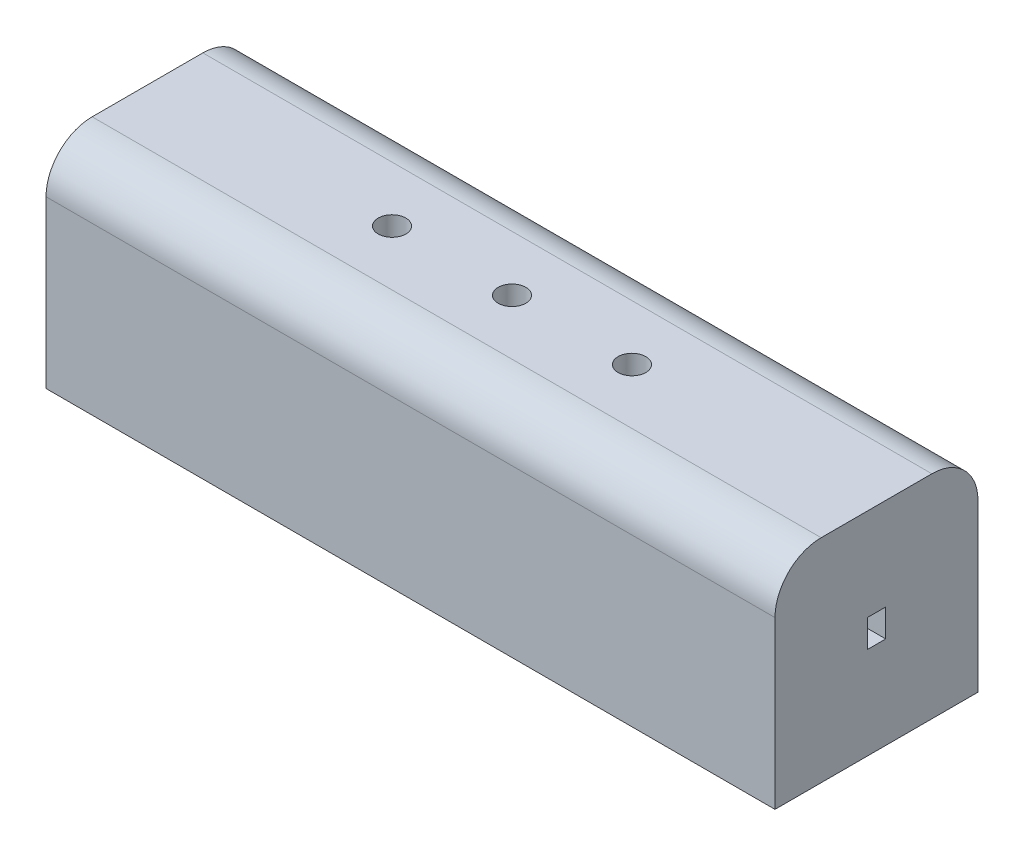
ISO-10303-21;
HEADER;
FILE_DESCRIPTION(('STEP AP214'),'2;1');
FILE_NAME('part.step','',(''),(''),'','','');
FILE_SCHEMA(('AUTOMOTIVE_DESIGN { 1 0 10303 214 1 1 1 1 }'));
ENDSEC;
DATA;
#1=APPLICATION_CONTEXT('core data for automotive mechanical design processes');
#2=APPLICATION_PROTOCOL_DEFINITION('international standard','automotive_design',2000,#1);
#3=PRODUCT_CONTEXT('',#1,'mechanical');
#4=PRODUCT('Part','Part','',(#3));
#5=PRODUCT_RELATED_PRODUCT_CATEGORY('part','',(#4));
#6=PRODUCT_DEFINITION_FORMATION('','',#4);
#7=PRODUCT_DEFINITION_CONTEXT('part definition',#1,'design');
#8=PRODUCT_DEFINITION('design','',#6,#7);
#9=PRODUCT_DEFINITION_SHAPE('','',#8);
#10=(LENGTH_UNIT() NAMED_UNIT(*) SI_UNIT(.MILLI.,.METRE.));
#11=(NAMED_UNIT(*) PLANE_ANGLE_UNIT() SI_UNIT($,.RADIAN.));
#12=(NAMED_UNIT(*) SI_UNIT($,.STERADIAN.) SOLID_ANGLE_UNIT());
#13=UNCERTAINTY_MEASURE_WITH_UNIT(LENGTH_MEASURE(1.E-05),#10,'distance_accuracy_value','');
#14=(GEOMETRIC_REPRESENTATION_CONTEXT(3) GLOBAL_UNCERTAINTY_ASSIGNED_CONTEXT((#13)) GLOBAL_UNIT_ASSIGNED_CONTEXT((#10,
#11,#12)) REPRESENTATION_CONTEXT('',''));
#15=CARTESIAN_POINT('',(0.,0.,0.));
#16=DIRECTION('',(0.,0.,1.));
#17=DIRECTION('',(1.,0.,0.));
#18=AXIS2_PLACEMENT_3D('',#15,#16,#17);
#19=CARTESIAN_POINT('',(39.5,0.,-1.));
#20=DIRECTION('',(0.,0.,-1.));
#21=DIRECTION('',(-1.,0.,0.));
#22=AXIS2_PLACEMENT_3D('',#19,#20,#21);
#23=PLANE('',#22);
#24=DIRECTION('',(-1.,0.,0.));
#25=VECTOR('',#24,1.);
#26=CARTESIAN_POINT('',(39.5,10.,-1.));
#27=LINE('',#26,#25);
#28=CARTESIAN_POINT('',(-14.1180339887499,10.,-1.));
#29=VERTEX_POINT('',#28);
#30=CARTESIAN_POINT('',(-39.5,10.,-1.));
#31=VERTEX_POINT('',#30);
#32=EDGE_CURVE('E282',#29,#31,#27,.T.);
#33=ORIENTED_EDGE('',*,*,#32,.F.);
#34=DIRECTION('',(0.,1.,0.));
#35=VECTOR('',#34,1.);
#36=CARTESIAN_POINT('',(-14.1180339887499,-1.2E-05,-1.));
#37=LINE('',#36,#35);
#38=CARTESIAN_POINT('',(-14.1180339887499,13.,-1.));
#39=VERTEX_POINT('',#38);
#40=EDGE_CURVE('E252',#29,#39,#37,.T.);
#41=ORIENTED_EDGE('',*,*,#40,.T.);
#42=DIRECTION('',(-1.,0.,0.));
#43=VECTOR('',#42,1.);
#44=CARTESIAN_POINT('',(39.5,13.,-1.));
#45=LINE('',#44,#43);
#46=CARTESIAN_POINT('',(-39.5,13.,-1.));
#47=VERTEX_POINT('',#46);
#48=EDGE_CURVE('E338',#39,#47,#45,.T.);
#49=ORIENTED_EDGE('',*,*,#48,.T.);
#50=DIRECTION('',(0.,-1.,0.));
#51=VECTOR('',#50,1.);
#52=CARTESIAN_POINT('',(-39.5,0.,-1.));
#53=LINE('',#52,#51);
#54=EDGE_CURVE('E408',#47,#31,#53,.T.);
#55=ORIENTED_EDGE('',*,*,#54,.T.);
#56=EDGE_LOOP('',(#33,#41,#49,#55));
#57=FACE_BOUND('',#56,.T.);
#58=ADVANCED_FACE('F98',(#57),#23,.F.);
#59=CARTESIAN_POINT('',(39.5,13.,0.));
#60=DIRECTION('',(0.,1.,0.));
#61=DIRECTION('',(0.,0.,1.));
#62=AXIS2_PLACEMENT_3D('',#59,#60,#61);
#63=PLANE('',#62);
#64=DIRECTION('',(-1.,0.,0.));
#65=VECTOR('',#64,1.);
#66=CARTESIAN_POINT('',(39.5,13.,0.999999999999997));
#67=LINE('',#66,#65);
#68=CARTESIAN_POINT('',(39.5,13.,0.999999999999997));
#69=VERTEX_POINT('',#68);
#70=CARTESIAN_POINT('',(14.1180339887499,13.,0.999999999999997));
#71=VERTEX_POINT('',#70);
#72=EDGE_CURVE('E289',#69,#71,#67,.T.);
#73=ORIENTED_EDGE('',*,*,#72,.T.);
#74=CARTESIAN_POINT('',(13.,13.,0.));
#75=DIRECTION('',(0.,1.,0.));
#76=DIRECTION('',(0.,0.,1.));
#77=AXIS2_PLACEMENT_3D('',#74,#75,#76);
#78=CIRCLE('',#77,1.5);
#79=CARTESIAN_POINT('',(14.1180339887499,13.,-1.));
#80=VERTEX_POINT('',#79);
#81=EDGE_CURVE('E398',#71,#80,#78,.T.);
#82=ORIENTED_EDGE('',*,*,#81,.T.);
#83=CARTESIAN_POINT('',(39.5,13.,-1.));
#84=VERTEX_POINT('',#83);
#85=EDGE_CURVE('E332',#84,#80,#45,.T.);
#86=ORIENTED_EDGE('',*,*,#85,.F.);
#87=DIRECTION('',(0.,0.,-1.));
#88=VECTOR('',#87,1.);
#89=CARTESIAN_POINT('',(39.5,13.,0.));
#90=LINE('',#89,#88);
#91=EDGE_CURVE('E439',#69,#84,#90,.T.);
#92=ORIENTED_EDGE('',*,*,#91,.F.);
#93=EDGE_LOOP('',(#73,#82,#86,#92));
#94=FACE_BOUND('',#93,.T.);
#95=ADVANCED_FACE('F463',(#94),#63,.F.);
#96=CARTESIAN_POINT('',(39.5,0.,0.999999999999997));
#97=DIRECTION('',(0.,0.,-1.));
#98=DIRECTION('',(-1.,0.,0.));
#99=AXIS2_PLACEMENT_3D('',#96,#97,#98);
#100=PLANE('',#99);
#101=DIRECTION('',(0.,1.,0.));
#102=VECTOR('',#101,1.);
#103=CARTESIAN_POINT('',(-14.1180339887499,-1.2E-05,0.999999999999997));
#104=LINE('',#103,#102);
#105=CARTESIAN_POINT('',(-14.1180339887499,10.,0.999999999999997));
#106=VERTEX_POINT('',#105);
#107=CARTESIAN_POINT('',(-14.1180339887499,13.,0.999999999999997));
#108=VERTEX_POINT('',#107);
#109=EDGE_CURVE('E249',#106,#108,#104,.T.);
#110=ORIENTED_EDGE('',*,*,#109,.F.);
#111=DIRECTION('',(-1.,0.,0.));
#112=VECTOR('',#111,1.);
#113=CARTESIAN_POINT('',(39.5,10.,0.999999999999997));
#114=LINE('',#113,#112);
#115=CARTESIAN_POINT('',(-39.5,10.,0.999999999999997));
#116=VERTEX_POINT('',#115);
#117=EDGE_CURVE('E263',#106,#116,#114,.T.);
#118=ORIENTED_EDGE('',*,*,#117,.T.);
#119=DIRECTION('',(0.,-1.,0.));
#120=VECTOR('',#119,1.);
#121=CARTESIAN_POINT('',(-39.5,0.,0.999999999999997));
#122=LINE('',#121,#120);
#123=CARTESIAN_POINT('',(-39.5,13.,0.999999999999997));
#124=VERTEX_POINT('',#123);
#125=EDGE_CURVE('E411',#124,#116,#122,.T.);
#126=ORIENTED_EDGE('',*,*,#125,.F.);
#127=EDGE_CURVE('E265',#108,#124,#67,.T.);
#128=ORIENTED_EDGE('',*,*,#127,.F.);
#129=EDGE_LOOP('',(#110,#118,#126,#128));
#130=FACE_BOUND('',#129,.T.);
#131=ADVANCED_FACE('F261',(#130),#100,.T.);
#132=CARTESIAN_POINT('',(39.5,10.,0.));
#133=DIRECTION('',(0.,1.,0.));
#134=DIRECTION('',(0.,0.,1.));
#135=AXIS2_PLACEMENT_3D('',#132,#133,#134);
#136=PLANE('',#135);
#137=CARTESIAN_POINT('',(13.,10.,0.));
#138=DIRECTION('',(0.,1.,0.));
#139=DIRECTION('',(0.,0.,1.));
#140=AXIS2_PLACEMENT_3D('',#137,#138,#139);
#141=CIRCLE('',#140,1.5);
#142=CARTESIAN_POINT('',(14.1180339887499,10.,0.999999999999997));
#143=VERTEX_POINT('',#142);
#144=CARTESIAN_POINT('',(14.1180339887499,10.,-1.));
#145=VERTEX_POINT('',#144);
#146=EDGE_CURVE('E12',#143,#145,#141,.T.);
#147=ORIENTED_EDGE('',*,*,#146,.F.);
#148=CARTESIAN_POINT('',(39.5,10.,0.999999999999997));
#149=VERTEX_POINT('',#148);
#150=EDGE_CURVE('E276',#149,#143,#114,.T.);
#151=ORIENTED_EDGE('',*,*,#150,.F.);
#152=DIRECTION('',(0.,0.,-1.));
#153=VECTOR('',#152,1.);
#154=CARTESIAN_POINT('',(39.5,10.,0.));
#155=LINE('',#154,#153);
#156=CARTESIAN_POINT('',(39.5,10.,-1.));
#157=VERTEX_POINT('',#156);
#158=EDGE_CURVE('E436',#149,#157,#155,.T.);
#159=ORIENTED_EDGE('',*,*,#158,.T.);
#160=EDGE_CURVE('E274',#157,#145,#27,.T.);
#161=ORIENTED_EDGE('',*,*,#160,.T.);
#162=EDGE_LOOP('',(#147,#151,#159,#161));
#163=FACE_BOUND('',#162,.T.);
#164=ADVANCED_FACE('F531',(#163),#136,.T.);
#165=CARTESIAN_POINT('',(39.5,0.,-11.));
#166=DIRECTION('',(0.,0.,-1.));
#167=DIRECTION('',(-1.,0.,0.));
#168=AXIS2_PLACEMENT_3D('',#165,#166,#167);
#169=PLANE('',#168);
#170=DIRECTION('',(-1.,0.,0.));
#171=VECTOR('',#170,1.);
#172=CARTESIAN_POINT('',(39.5,0.,-11.));
#173=LINE('',#172,#171);
#174=CARTESIAN_POINT('',(39.5,0.,-11.));
#175=VERTEX_POINT('',#174);
#176=CARTESIAN_POINT('',(-39.5,0.,-11.));
#177=VERTEX_POINT('',#176);
#178=EDGE_CURVE('E307',#175,#177,#173,.T.);
#179=ORIENTED_EDGE('',*,*,#178,.T.);
#180=DIRECTION('',(0.,-1.,0.));
#181=VECTOR('',#180,1.);
#182=CARTESIAN_POINT('',(-39.5,0.,-11.));
#183=LINE('',#182,#181);
#184=CARTESIAN_POINT('',(-39.5,18.,-11.));
#185=VERTEX_POINT('',#184);
#186=EDGE_CURVE('E415',#185,#177,#183,.T.);
#187=ORIENTED_EDGE('',*,*,#186,.F.);
#188=DIRECTION('',(-1.,0.,0.));
#189=VECTOR('',#188,1.);
#190=CARTESIAN_POINT('',(39.5,18.,-11.));
#191=LINE('',#190,#189);
#192=CARTESIAN_POINT('',(39.5,18.,-11.));
#193=VERTEX_POINT('',#192);
#194=EDGE_CURVE('E257',#193,#185,#191,.T.);
#195=ORIENTED_EDGE('',*,*,#194,.F.);
#196=DIRECTION('',(0.,-1.,0.));
#197=VECTOR('',#196,1.);
#198=CARTESIAN_POINT('',(39.5,0.,-11.));
#199=LINE('',#198,#197);
#200=EDGE_CURVE('E330',#193,#175,#199,.T.);
#201=ORIENTED_EDGE('',*,*,#200,.T.);
#202=EDGE_LOOP('',(#179,#187,#195,#201));
#203=FACE_BOUND('',#202,.T.);
#204=ADVANCED_FACE('F100',(#203),#169,.T.);
#205=CARTESIAN_POINT('',(39.5,18.,-6.));
#206=DIRECTION('',(-1.,0.,0.));
#207=DIRECTION('',(0.,0.,1.));
#208=AXIS2_PLACEMENT_3D('',#205,#206,#207);
#209=CYLINDRICAL_SURFACE('',#208,5.);
#210=ORIENTED_EDGE('',*,*,#194,.T.);
#211=CARTESIAN_POINT('',(-39.5,18.,-6.));
#212=DIRECTION('',(1.,0.,0.));
#213=DIRECTION('',(0.,0.,-1.));
#214=AXIS2_PLACEMENT_3D('',#211,#212,#213);
#215=CIRCLE('',#214,5.);
#216=CARTESIAN_POINT('',(-39.5,23.,-5.99999999999997));
#217=VERTEX_POINT('',#216);
#218=EDGE_CURVE('E430',#185,#217,#215,.T.);
#219=ORIENTED_EDGE('',*,*,#218,.T.);
#220=DIRECTION('',(-1.,0.,0.));
#221=VECTOR('',#220,1.);
#222=CARTESIAN_POINT('',(39.5,23.,-5.99999999999997));
#223=LINE('',#222,#221);
#224=CARTESIAN_POINT('',(39.5,23.,-5.99999999999997));
#225=VERTEX_POINT('',#224);
#226=EDGE_CURVE('E316',#225,#217,#223,.T.);
#227=ORIENTED_EDGE('',*,*,#226,.F.);
#228=CARTESIAN_POINT('',(39.5,18.,-6.));
#229=DIRECTION('',(1.,0.,0.));
#230=DIRECTION('',(0.,0.,-1.));
#231=AXIS2_PLACEMENT_3D('',#228,#229,#230);
#232=CIRCLE('',#231,5.);
#233=EDGE_CURVE('E310',#193,#225,#232,.T.);
#234=ORIENTED_EDGE('',*,*,#233,.F.);
#235=EDGE_LOOP('',(#210,#219,#227,#234));
#236=FACE_BOUND('',#235,.T.);
#237=ADVANCED_FACE('F529',(#236),#209,.T.);
#238=CARTESIAN_POINT('',(39.5,23.,0.));
#239=DIRECTION('',(0.,1.,0.));
#240=DIRECTION('',(0.,0.,1.));
#241=AXIS2_PLACEMENT_3D('',#238,#239,#240);
#242=PLANE('',#241);
#243=CARTESIAN_POINT('',(13.,23.,0.));
#244=DIRECTION('',(0.,1.,0.));
#245=DIRECTION('',(0.,0.,1.));
#246=AXIS2_PLACEMENT_3D('',#243,#244,#245);
#247=CIRCLE('',#246,1.5);
#248=CARTESIAN_POINT('',(13.,23.,1.5));
#249=VERTEX_POINT('',#248);
#250=EDGE_CURVE('E267',#249,#249,#247,.T.);
#251=ORIENTED_EDGE('',*,*,#250,.F.);
#252=EDGE_LOOP('',(#251));
#253=FACE_BOUND('',#252,.T.);
#254=CARTESIAN_POINT('',(0.,23.,0.));
#255=DIRECTION('',(0.,1.,0.));
#256=DIRECTION('',(0.,0.,1.));
#257=AXIS2_PLACEMENT_3D('',#254,#255,#256);
#258=CIRCLE('',#257,1.5);
#259=CARTESIAN_POINT('',(0.,23.,1.5));
#260=VERTEX_POINT('',#259);
#261=EDGE_CURVE('E730',#260,#260,#258,.T.);
#262=ORIENTED_EDGE('',*,*,#261,.F.);
#263=EDGE_LOOP('',(#262));
#264=FACE_BOUND('',#263,.T.);
#265=CARTESIAN_POINT('',(-13.,23.,0.));
#266=DIRECTION('',(0.,1.,0.));
#267=DIRECTION('',(0.,0.,1.));
#268=AXIS2_PLACEMENT_3D('',#265,#266,#267);
#269=CIRCLE('',#268,1.5);
#270=CARTESIAN_POINT('',(-13.,23.,1.5));
#271=VERTEX_POINT('',#270);
#272=EDGE_CURVE('E733',#271,#271,#269,.T.);
#273=ORIENTED_EDGE('',*,*,#272,.F.);
#274=EDGE_LOOP('',(#273));
#275=FACE_BOUND('',#274,.T.);
#276=ORIENTED_EDGE('',*,*,#226,.T.);
#277=DIRECTION('',(0.,0.,-1.));
#278=VECTOR('',#277,1.);
#279=CARTESIAN_POINT('',(-39.5,23.,0.));
#280=LINE('',#279,#278);
#281=CARTESIAN_POINT('',(-39.5,23.,5.99999999999996));
#282=VERTEX_POINT('',#281);
#283=EDGE_CURVE('E427',#282,#217,#280,.T.);
#284=ORIENTED_EDGE('',*,*,#283,.F.);
#285=DIRECTION('',(-1.,0.,0.));
#286=VECTOR('',#285,1.);
#287=CARTESIAN_POINT('',(39.5,23.,5.99999999999996));
#288=LINE('',#287,#286);
#289=CARTESIAN_POINT('',(39.5,23.,5.99999999999996));
#290=VERTEX_POINT('',#289);
#291=EDGE_CURVE('E314',#290,#282,#288,.T.);
#292=ORIENTED_EDGE('',*,*,#291,.F.);
#293=DIRECTION('',(0.,0.,-1.));
#294=VECTOR('',#293,1.);
#295=CARTESIAN_POINT('',(39.5,23.,0.));
#296=LINE('',#295,#294);
#297=EDGE_CURVE('E320',#290,#225,#296,.T.);
#298=ORIENTED_EDGE('',*,*,#297,.T.);
#299=EDGE_LOOP('',(#276,#284,#292,#298));
#300=FACE_BOUND('',#299,.T.);
#301=ADVANCED_FACE('F524',(#253,#264,#275,#300),#242,.T.);
#302=CARTESIAN_POINT('',(39.5,18.,6.));
#303=DIRECTION('',(-1.,0.,0.));
#304=DIRECTION('',(0.,0.,1.));
#305=AXIS2_PLACEMENT_3D('',#302,#303,#304);
#306=CYLINDRICAL_SURFACE('',#305,5.);
#307=ORIENTED_EDGE('',*,*,#291,.T.);
#308=CARTESIAN_POINT('',(-39.5,18.,6.));
#309=DIRECTION('',(1.,0.,0.));
#310=DIRECTION('',(0.,0.,-1.));
#311=AXIS2_PLACEMENT_3D('',#308,#309,#310);
#312=CIRCLE('',#311,5.);
#313=CARTESIAN_POINT('',(-39.5,18.,11.));
#314=VERTEX_POINT('',#313);
#315=EDGE_CURVE('E424',#314,#282,#312,.F.);
#316=ORIENTED_EDGE('',*,*,#315,.F.);
#317=DIRECTION('',(-1.,0.,0.));
#318=VECTOR('',#317,1.);
#319=CARTESIAN_POINT('',(39.5,18.,11.));
#320=LINE('',#319,#318);
#321=CARTESIAN_POINT('',(39.5,18.,11.));
#322=VERTEX_POINT('',#321);
#323=EDGE_CURVE('E312',#322,#314,#320,.T.);
#324=ORIENTED_EDGE('',*,*,#323,.F.);
#325=CARTESIAN_POINT('',(39.5,18.,6.));
#326=DIRECTION('',(1.,0.,0.));
#327=DIRECTION('',(0.,0.,-1.));
#328=AXIS2_PLACEMENT_3D('',#325,#326,#327);
#329=CIRCLE('',#328,5.);
#330=EDGE_CURVE('E323',#322,#290,#329,.F.);
#331=ORIENTED_EDGE('',*,*,#330,.T.);
#332=EDGE_LOOP('',(#307,#316,#324,#331));
#333=FACE_BOUND('',#332,.T.);
#334=ADVANCED_FACE('F521',(#333),#306,.T.);
#335=CARTESIAN_POINT('',(39.5,0.,11.));
#336=DIRECTION('',(0.,0.,-1.));
#337=DIRECTION('',(-1.,0.,0.));
#338=AXIS2_PLACEMENT_3D('',#335,#336,#337);
#339=PLANE('',#338);
#340=ORIENTED_EDGE('',*,*,#323,.T.);
#341=DIRECTION('',(0.,-1.,0.));
#342=VECTOR('',#341,1.);
#343=CARTESIAN_POINT('',(-39.5,0.,11.));
#344=LINE('',#343,#342);
#345=CARTESIAN_POINT('',(-39.5,0.,11.));
#346=VERTEX_POINT('',#345);
#347=EDGE_CURVE('E421',#314,#346,#344,.T.);
#348=ORIENTED_EDGE('',*,*,#347,.T.);
#349=DIRECTION('',(-1.,0.,0.));
#350=VECTOR('',#349,1.);
#351=CARTESIAN_POINT('',(39.5,0.,11.));
#352=LINE('',#351,#350);
#353=CARTESIAN_POINT('',(39.5,0.,11.));
#354=VERTEX_POINT('',#353);
#355=EDGE_CURVE('E309',#354,#346,#352,.T.);
#356=ORIENTED_EDGE('',*,*,#355,.F.);
#357=DIRECTION('',(0.,-1.,0.));
#358=VECTOR('',#357,1.);
#359=CARTESIAN_POINT('',(39.5,0.,11.));
#360=LINE('',#359,#358);
#361=EDGE_CURVE('E326',#322,#354,#360,.T.);
#362=ORIENTED_EDGE('',*,*,#361,.F.);
#363=EDGE_LOOP('',(#340,#348,#356,#362));
#364=FACE_BOUND('',#363,.T.);
#365=ADVANCED_FACE('F503',(#364),#339,.F.);
#366=CARTESIAN_POINT('',(39.5,0.,0.));
#367=DIRECTION('',(0.,1.,0.));
#368=DIRECTION('',(0.,0.,1.));
#369=AXIS2_PLACEMENT_3D('',#366,#367,#368);
#370=PLANE('',#369);
#371=CARTESIAN_POINT('',(13.,0.,0.));
#372=DIRECTION('',(0.,1.,0.));
#373=DIRECTION('',(0.,0.,1.));
#374=AXIS2_PLACEMENT_3D('',#371,#372,#373);
#375=CIRCLE('',#374,1.5);
#376=CARTESIAN_POINT('',(13.,0.,1.5));
#377=VERTEX_POINT('',#376);
#378=EDGE_CURVE('E405',#377,#377,#375,.T.);
#379=ORIENTED_EDGE('',*,*,#378,.T.);
#380=EDGE_LOOP('',(#379));
#381=FACE_BOUND('',#380,.T.);
#382=CARTESIAN_POINT('',(0.,0.,0.));
#383=DIRECTION('',(0.,1.,0.));
#384=DIRECTION('',(0.,0.,1.));
#385=AXIS2_PLACEMENT_3D('',#382,#383,#384);
#386=CIRCLE('',#385,1.5);
#387=CARTESIAN_POINT('',(0.,0.,1.5));
#388=VERTEX_POINT('',#387);
#389=EDGE_CURVE('E391',#388,#388,#386,.T.);
#390=ORIENTED_EDGE('',*,*,#389,.T.);
#391=EDGE_LOOP('',(#390));
#392=FACE_BOUND('',#391,.T.);
#393=CARTESIAN_POINT('',(-13.,0.,0.));
#394=DIRECTION('',(0.,1.,0.));
#395=DIRECTION('',(0.,0.,1.));
#396=AXIS2_PLACEMENT_3D('',#393,#394,#395);
#397=CIRCLE('',#396,1.5);
#398=CARTESIAN_POINT('',(-13.,0.,1.5));
#399=VERTEX_POINT('',#398);
#400=EDGE_CURVE('E379',#399,#399,#397,.T.);
#401=ORIENTED_EDGE('',*,*,#400,.T.);
#402=EDGE_LOOP('',(#401));
#403=FACE_BOUND('',#402,.T.);
#404=ORIENTED_EDGE('',*,*,#355,.T.);
#405=DIRECTION('',(0.,0.,-1.));
#406=VECTOR('',#405,1.);
#407=CARTESIAN_POINT('',(-39.5,0.,0.));
#408=LINE('',#407,#406);
#409=EDGE_CURVE('E418',#346,#177,#408,.T.);
#410=ORIENTED_EDGE('',*,*,#409,.T.);
#411=ORIENTED_EDGE('',*,*,#178,.F.);
#412=DIRECTION('',(0.,0.,-1.));
#413=VECTOR('',#412,1.);
#414=CARTESIAN_POINT('',(39.5,0.,0.));
#415=LINE('',#414,#413);
#416=EDGE_CURVE('E328',#354,#175,#415,.T.);
#417=ORIENTED_EDGE('',*,*,#416,.F.);
#418=EDGE_LOOP('',(#404,#410,#411,#417));
#419=FACE_BOUND('',#418,.T.);
#420=ADVANCED_FACE('F500',(#381,#392,#403,#419),#370,.F.);
#421=CARTESIAN_POINT('',(39.5,18.,6.));
#422=DIRECTION('',(1.,0.,0.));
#423=DIRECTION('',(0.,0.,-1.));
#424=AXIS2_PLACEMENT_3D('',#421,#422,#423);
#425=PLANE('',#424);
#426=DIRECTION('',(0.,-1.,0.));
#427=VECTOR('',#426,1.);
#428=CARTESIAN_POINT('',(39.5,0.,-1.));
#429=LINE('',#428,#427);
#430=EDGE_CURVE('E433',#84,#157,#429,.T.);
#431=ORIENTED_EDGE('',*,*,#430,.T.);
#432=ORIENTED_EDGE('',*,*,#158,.F.);
#433=DIRECTION('',(0.,-1.,0.));
#434=VECTOR('',#433,1.);
#435=CARTESIAN_POINT('',(39.5,0.,0.999999999999997));
#436=LINE('',#435,#434);
#437=EDGE_CURVE('E438',#69,#149,#436,.T.);
#438=ORIENTED_EDGE('',*,*,#437,.F.);
#439=ORIENTED_EDGE('',*,*,#91,.T.);
#440=EDGE_LOOP('',(#431,#432,#438,#439));
#441=FACE_BOUND('',#440,.T.);
#442=ORIENTED_EDGE('',*,*,#200,.F.);
#443=ORIENTED_EDGE('',*,*,#233,.T.);
#444=ORIENTED_EDGE('',*,*,#297,.F.);
#445=ORIENTED_EDGE('',*,*,#330,.F.);
#446=ORIENTED_EDGE('',*,*,#361,.T.);
#447=ORIENTED_EDGE('',*,*,#416,.T.);
#448=EDGE_LOOP('',(#442,#443,#444,#445,#446,#447));
#449=FACE_BOUND('',#448,.T.);
#450=ADVANCED_FACE('F474',(#441,#449),#425,.T.);
#451=ORIENTED_EDGE('',*,*,#85,.T.);
#452=DIRECTION('',(0.,1.,0.));
#453=VECTOR('',#452,1.);
#454=CARTESIAN_POINT('',(14.1180339887499,-1.2E-05,-1.));
#455=LINE('',#454,#453);
#456=EDGE_CURVE('E403',#80,#145,#455,.F.);
#457=ORIENTED_EDGE('',*,*,#456,.T.);
#458=ORIENTED_EDGE('',*,*,#160,.F.);
#459=ORIENTED_EDGE('',*,*,#430,.F.);
#460=EDGE_LOOP('',(#451,#457,#458,#459));
#461=FACE_BOUND('',#460,.T.);
#462=ADVANCED_FACE('F465',(#461),#23,.F.);
#463=ORIENTED_EDGE('',*,*,#48,.F.);
#464=CARTESIAN_POINT('',(-13.,13.,0.));
#465=DIRECTION('',(0.,1.,0.));
#466=DIRECTION('',(0.,0.,1.));
#467=AXIS2_PLACEMENT_3D('',#464,#465,#466);
#468=CIRCLE('',#467,1.5);
#469=EDGE_CURVE('E266',#39,#108,#468,.T.);
#470=ORIENTED_EDGE('',*,*,#469,.T.);
#471=ORIENTED_EDGE('',*,*,#127,.T.);
#472=DIRECTION('',(0.,0.,-1.));
#473=VECTOR('',#472,1.);
#474=CARTESIAN_POINT('',(-39.5,13.,0.));
#475=LINE('',#474,#473);
#476=EDGE_CURVE('E413',#124,#47,#475,.T.);
#477=ORIENTED_EDGE('',*,*,#476,.T.);
#478=EDGE_LOOP('',(#463,#470,#471,#477));
#479=FACE_BOUND('',#478,.T.);
#480=ADVANCED_FACE('F471',(#479),#63,.F.);
#481=DIRECTION('',(0.,1.,0.));
#482=VECTOR('',#481,1.);
#483=CARTESIAN_POINT('',(14.1180339887499,-1.2E-05,0.999999999999997));
#484=LINE('',#483,#482);
#485=EDGE_CURVE('E401',#71,#143,#484,.F.);
#486=ORIENTED_EDGE('',*,*,#485,.F.);
#487=ORIENTED_EDGE('',*,*,#72,.F.);
#488=ORIENTED_EDGE('',*,*,#437,.T.);
#489=ORIENTED_EDGE('',*,*,#150,.T.);
#490=EDGE_LOOP('',(#486,#487,#488,#489));
#491=FACE_BOUND('',#490,.T.);
#492=ADVANCED_FACE('F542',(#491),#100,.T.);
#493=CARTESIAN_POINT('',(-13.,10.,0.));
#494=DIRECTION('',(0.,1.,0.));
#495=DIRECTION('',(0.,0.,1.));
#496=AXIS2_PLACEMENT_3D('',#493,#494,#495);
#497=CIRCLE('',#496,1.5);
#498=EDGE_CURVE('E245',#29,#106,#497,.T.);
#499=ORIENTED_EDGE('',*,*,#498,.F.);
#500=ORIENTED_EDGE('',*,*,#32,.T.);
#501=DIRECTION('',(0.,0.,-1.));
#502=VECTOR('',#501,1.);
#503=CARTESIAN_POINT('',(-39.5,10.,0.));
#504=LINE('',#503,#502);
#505=EDGE_CURVE('E271',#116,#31,#504,.T.);
#506=ORIENTED_EDGE('',*,*,#505,.F.);
#507=ORIENTED_EDGE('',*,*,#117,.F.);
#508=EDGE_LOOP('',(#499,#500,#506,#507));
#509=FACE_BOUND('',#508,.T.);
#510=ADVANCED_FACE('F269',(#509),#136,.T.);
#511=CARTESIAN_POINT('',(-39.5,18.,6.));
#512=DIRECTION('',(1.,0.,0.));
#513=DIRECTION('',(0.,0.,-1.));
#514=AXIS2_PLACEMENT_3D('',#511,#512,#513);
#515=PLANE('',#514);
#516=ORIENTED_EDGE('',*,*,#186,.T.);
#517=ORIENTED_EDGE('',*,*,#409,.F.);
#518=ORIENTED_EDGE('',*,*,#347,.F.);
#519=ORIENTED_EDGE('',*,*,#315,.T.);
#520=ORIENTED_EDGE('',*,*,#283,.T.);
#521=ORIENTED_EDGE('',*,*,#218,.F.);
#522=EDGE_LOOP('',(#516,#517,#518,#519,#520,#521));
#523=FACE_BOUND('',#522,.T.);
#524=ORIENTED_EDGE('',*,*,#54,.F.);
#525=ORIENTED_EDGE('',*,*,#476,.F.);
#526=ORIENTED_EDGE('',*,*,#125,.T.);
#527=ORIENTED_EDGE('',*,*,#505,.T.);
#528=EDGE_LOOP('',(#524,#525,#526,#527));
#529=FACE_BOUND('',#528,.T.);
#530=ADVANCED_FACE('F452',(#523,#529),#515,.F.);
#531=CARTESIAN_POINT('',(-13.,-1.2E-05,0.));
#532=DIRECTION('',(0.,1.,0.));
#533=DIRECTION('',(0.,0.,1.));
#534=AXIS2_PLACEMENT_3D('',#531,#532,#533);
#535=CYLINDRICAL_SURFACE('',#534,1.5);
#536=CARTESIAN_POINT('',(-11.8819660112501,13.,0.999999999999997));
#537=VERTEX_POINT('',#536);
#538=CARTESIAN_POINT('',(-11.8819660112501,13.,-1.));
#539=VERTEX_POINT('',#538);
#540=EDGE_CURVE('E365',#537,#539,#468,.T.);
#541=ORIENTED_EDGE('',*,*,#540,.F.);
#542=DIRECTION('',(0.,1.,0.));
#543=VECTOR('',#542,1.);
#544=CARTESIAN_POINT('',(-11.8819660112501,-1.2E-05,0.999999999999997));
#545=LINE('',#544,#543);
#546=CARTESIAN_POINT('',(-11.8819660112501,10.,0.999999999999997));
#547=VERTEX_POINT('',#546);
#548=EDGE_CURVE('E113',#537,#547,#545,.F.);
#549=ORIENTED_EDGE('',*,*,#548,.T.);
#550=CARTESIAN_POINT('',(-11.8819660112501,10.,-1.));
#551=VERTEX_POINT('',#550);
#552=EDGE_CURVE('E256',#547,#551,#497,.T.);
#553=ORIENTED_EDGE('',*,*,#552,.T.);
#554=DIRECTION('',(0.,1.,0.));
#555=VECTOR('',#554,1.);
#556=CARTESIAN_POINT('',(-11.8819660112501,-1.2E-05,-1.));
#557=LINE('',#556,#555);
#558=EDGE_CURVE('E373',#539,#551,#557,.F.);
#559=ORIENTED_EDGE('',*,*,#558,.F.);
#560=EDGE_LOOP('',(#541,#549,#553,#559));
#561=FACE_BOUND('',#560,.T.);
#562=ORIENTED_EDGE('',*,*,#498,.T.);
#563=ORIENTED_EDGE('',*,*,#109,.T.);
#564=ORIENTED_EDGE('',*,*,#469,.F.);
#565=ORIENTED_EDGE('',*,*,#40,.F.);
#566=EDGE_LOOP('',(#562,#563,#564,#565));
#567=FACE_BOUND('',#566,.T.);
#568=ORIENTED_EDGE('',*,*,#272,.T.);
#569=EDGE_LOOP('',(#568));
#570=FACE_BOUND('',#569,.T.);
#571=ORIENTED_EDGE('',*,*,#400,.F.);
#572=EDGE_LOOP('',(#571));
#573=FACE_BOUND('',#572,.T.);
#574=ADVANCED_FACE('F247',(#561,#567,#570,#573),#535,.F.);
#575=CARTESIAN_POINT('',(0.,10.,0.));
#576=DIRECTION('',(0.,1.,0.));
#577=DIRECTION('',(0.,0.,1.));
#578=AXIS2_PLACEMENT_3D('',#575,#576,#577);
#579=CIRCLE('',#578,1.5);
#580=CARTESIAN_POINT('',(-1.11803398874989,10.,-1.));
#581=VERTEX_POINT('',#580);
#582=CARTESIAN_POINT('',(-1.11803398874989,10.,0.999999999999997));
#583=VERTEX_POINT('',#582);
#584=EDGE_CURVE('E305',#581,#583,#579,.T.);
#585=ORIENTED_EDGE('',*,*,#584,.F.);
#586=EDGE_CURVE('E443',#581,#551,#27,.T.);
#587=ORIENTED_EDGE('',*,*,#586,.T.);
#588=ORIENTED_EDGE('',*,*,#552,.F.);
#589=EDGE_CURVE('E273',#583,#547,#114,.T.);
#590=ORIENTED_EDGE('',*,*,#589,.F.);
#591=EDGE_LOOP('',(#585,#587,#588,#590));
#592=FACE_BOUND('',#591,.T.);
#593=ADVANCED_FACE('F448',(#592),#136,.T.);
#594=DIRECTION('',(0.,1.,0.));
#595=VECTOR('',#594,1.);
#596=CARTESIAN_POINT('',(-1.11803398874989,-1.2E-05,0.999999999999997));
#597=LINE('',#596,#595);
#598=CARTESIAN_POINT('',(-1.11803398874989,13.,0.999999999999997));
#599=VERTEX_POINT('',#598);
#600=EDGE_CURVE('E370',#583,#599,#597,.T.);
#601=ORIENTED_EDGE('',*,*,#600,.F.);
#602=ORIENTED_EDGE('',*,*,#589,.T.);
#603=ORIENTED_EDGE('',*,*,#548,.F.);
#604=EDGE_CURVE('E288',#599,#537,#67,.T.);
#605=ORIENTED_EDGE('',*,*,#604,.F.);
#606=EDGE_LOOP('',(#601,#602,#603,#605));
#607=FACE_BOUND('',#606,.T.);
#608=ADVANCED_FACE('F369',(#607),#100,.T.);
#609=CARTESIAN_POINT('',(-1.11803398874989,13.,-1.));
#610=VERTEX_POINT('',#609);
#611=EDGE_CURVE('E343',#610,#539,#45,.T.);
#612=ORIENTED_EDGE('',*,*,#611,.F.);
#613=CARTESIAN_POINT('',(0.,13.,0.));
#614=DIRECTION('',(0.,1.,0.));
#615=DIRECTION('',(0.,0.,1.));
#616=AXIS2_PLACEMENT_3D('',#613,#614,#615);
#617=CIRCLE('',#616,1.5);
#618=EDGE_CURVE('E366',#610,#599,#617,.T.);
#619=ORIENTED_EDGE('',*,*,#618,.T.);
#620=ORIENTED_EDGE('',*,*,#604,.T.);
#621=ORIENTED_EDGE('',*,*,#540,.T.);
#622=EDGE_LOOP('',(#612,#619,#620,#621));
#623=FACE_BOUND('',#622,.T.);
#624=ADVANCED_FACE('F364',(#623),#63,.F.);
#625=ORIENTED_EDGE('',*,*,#586,.F.);
#626=DIRECTION('',(0.,1.,0.));
#627=VECTOR('',#626,1.);
#628=CARTESIAN_POINT('',(-1.11803398874989,-1.2E-05,-1.));
#629=LINE('',#628,#627);
#630=EDGE_CURVE('E384',#581,#610,#629,.T.);
#631=ORIENTED_EDGE('',*,*,#630,.T.);
#632=ORIENTED_EDGE('',*,*,#611,.T.);
#633=ORIENTED_EDGE('',*,*,#558,.T.);
#634=EDGE_LOOP('',(#625,#631,#632,#633));
#635=FACE_BOUND('',#634,.T.);
#636=ADVANCED_FACE('F450',(#635),#23,.F.);
#637=CARTESIAN_POINT('',(0.,-1.2E-05,0.));
#638=DIRECTION('',(0.,1.,0.));
#639=DIRECTION('',(0.,0.,1.));
#640=AXIS2_PLACEMENT_3D('',#637,#638,#639);
#641=CYLINDRICAL_SURFACE('',#640,1.5);
#642=CARTESIAN_POINT('',(1.11803398874991,13.,0.999999999999997));
#643=VERTEX_POINT('',#642);
#644=CARTESIAN_POINT('',(1.1180339887499,13.,-1.));
#645=VERTEX_POINT('',#644);
#646=EDGE_CURVE('E385',#643,#645,#617,.T.);
#647=ORIENTED_EDGE('',*,*,#646,.F.);
#648=DIRECTION('',(0.,1.,0.));
#649=VECTOR('',#648,1.);
#650=CARTESIAN_POINT('',(1.11803398874991,-1.2E-05,0.999999999999997));
#651=LINE('',#650,#649);
#652=CARTESIAN_POINT('',(1.11803398874991,10.,0.999999999999997));
#653=VERTEX_POINT('',#652);
#654=EDGE_CURVE('E121',#643,#653,#651,.F.);
#655=ORIENTED_EDGE('',*,*,#654,.T.);
#656=CARTESIAN_POINT('',(1.1180339887499,10.,-1.));
#657=VERTEX_POINT('',#656);
#658=EDGE_CURVE('E303',#653,#657,#579,.T.);
#659=ORIENTED_EDGE('',*,*,#658,.T.);
#660=DIRECTION('',(0.,1.,0.));
#661=VECTOR('',#660,1.);
#662=CARTESIAN_POINT('',(1.1180339887499,-1.2E-05,-1.));
#663=LINE('',#662,#661);
#664=EDGE_CURVE('E389',#645,#657,#663,.F.);
#665=ORIENTED_EDGE('',*,*,#664,.F.);
#666=EDGE_LOOP('',(#647,#655,#659,#665));
#667=FACE_BOUND('',#666,.T.);
#668=ORIENTED_EDGE('',*,*,#584,.T.);
#669=ORIENTED_EDGE('',*,*,#600,.T.);
#670=ORIENTED_EDGE('',*,*,#618,.F.);
#671=ORIENTED_EDGE('',*,*,#630,.F.);
#672=EDGE_LOOP('',(#668,#669,#670,#671));
#673=FACE_BOUND('',#672,.T.);
#674=ORIENTED_EDGE('',*,*,#261,.T.);
#675=EDGE_LOOP('',(#674));
#676=FACE_BOUND('',#675,.T.);
#677=ORIENTED_EDGE('',*,*,#389,.F.);
#678=EDGE_LOOP('',(#677));
#679=FACE_BOUND('',#678,.T.);
#680=ADVANCED_FACE('F477',(#667,#673,#676,#679),#641,.F.);
#681=CARTESIAN_POINT('',(11.8819660112501,10.,-1.));
#682=VERTEX_POINT('',#681);
#683=CARTESIAN_POINT('',(11.8819660112501,10.,0.999999999999997));
#684=VERTEX_POINT('',#683);
#685=EDGE_CURVE('E102',#682,#684,#141,.T.);
#686=ORIENTED_EDGE('',*,*,#685,.F.);
#687=EDGE_CURVE('E280',#682,#657,#27,.T.);
#688=ORIENTED_EDGE('',*,*,#687,.T.);
#689=ORIENTED_EDGE('',*,*,#658,.F.);
#690=EDGE_CURVE('E278',#684,#653,#114,.T.);
#691=ORIENTED_EDGE('',*,*,#690,.F.);
#692=EDGE_LOOP('',(#686,#688,#689,#691));
#693=FACE_BOUND('',#692,.T.);
#694=ADVANCED_FACE('F300',(#693),#136,.T.);
#695=DIRECTION('',(0.,1.,0.));
#696=VECTOR('',#695,1.);
#697=CARTESIAN_POINT('',(11.8819660112501,-1.2E-05,0.999999999999997));
#698=LINE('',#697,#696);
#699=CARTESIAN_POINT('',(11.8819660112501,13.,0.999999999999997));
#700=VERTEX_POINT('',#699);
#701=EDGE_CURVE('E297',#684,#700,#698,.T.);
#702=ORIENTED_EDGE('',*,*,#701,.F.);
#703=ORIENTED_EDGE('',*,*,#690,.T.);
#704=ORIENTED_EDGE('',*,*,#654,.F.);
#705=EDGE_CURVE('E351',#700,#643,#67,.T.);
#706=ORIENTED_EDGE('',*,*,#705,.F.);
#707=EDGE_LOOP('',(#702,#703,#704,#706));
#708=FACE_BOUND('',#707,.T.);
#709=ADVANCED_FACE('F294',(#708),#100,.T.);
#710=CARTESIAN_POINT('',(11.8819660112501,13.,-1.));
#711=VERTEX_POINT('',#710);
#712=EDGE_CURVE('E336',#711,#645,#45,.T.);
#713=ORIENTED_EDGE('',*,*,#712,.F.);
#714=EDGE_CURVE('E395',#711,#700,#78,.T.);
#715=ORIENTED_EDGE('',*,*,#714,.T.);
#716=ORIENTED_EDGE('',*,*,#705,.T.);
#717=ORIENTED_EDGE('',*,*,#646,.T.);
#718=EDGE_LOOP('',(#713,#715,#716,#717));
#719=FACE_BOUND('',#718,.T.);
#720=ADVANCED_FACE('F470',(#719),#63,.F.);
#721=ORIENTED_EDGE('',*,*,#687,.F.);
#722=DIRECTION('',(0.,1.,0.));
#723=VECTOR('',#722,1.);
#724=CARTESIAN_POINT('',(11.8819660112501,-1.2E-05,-1.));
#725=LINE('',#724,#723);
#726=EDGE_CURVE('E397',#682,#711,#725,.T.);
#727=ORIENTED_EDGE('',*,*,#726,.T.);
#728=ORIENTED_EDGE('',*,*,#712,.T.);
#729=ORIENTED_EDGE('',*,*,#664,.T.);
#730=EDGE_LOOP('',(#721,#727,#728,#729));
#731=FACE_BOUND('',#730,.T.);
#732=ADVANCED_FACE('F475',(#731),#23,.F.);
#733=CARTESIAN_POINT('',(13.,-1.2E-05,0.));
#734=DIRECTION('',(0.,1.,0.));
#735=DIRECTION('',(0.,0.,1.));
#736=AXIS2_PLACEMENT_3D('',#733,#734,#735);
#737=CYLINDRICAL_SURFACE('',#736,1.5);
#738=ORIENTED_EDGE('',*,*,#81,.F.);
#739=ORIENTED_EDGE('',*,*,#485,.T.);
#740=ORIENTED_EDGE('',*,*,#146,.T.);
#741=ORIENTED_EDGE('',*,*,#456,.F.);
#742=EDGE_LOOP('',(#738,#739,#740,#741));
#743=FACE_BOUND('',#742,.T.);
#744=ORIENTED_EDGE('',*,*,#685,.T.);
#745=ORIENTED_EDGE('',*,*,#701,.T.);
#746=ORIENTED_EDGE('',*,*,#714,.F.);
#747=ORIENTED_EDGE('',*,*,#726,.F.);
#748=EDGE_LOOP('',(#744,#745,#746,#747));
#749=FACE_BOUND('',#748,.T.);
#750=ORIENTED_EDGE('',*,*,#250,.T.);
#751=EDGE_LOOP('',(#750));
#752=FACE_BOUND('',#751,.T.);
#753=ORIENTED_EDGE('',*,*,#378,.F.);
#754=EDGE_LOOP('',(#753));
#755=FACE_BOUND('',#754,.T.);
#756=ADVANCED_FACE('F483',(#743,#749,#752,#755),#737,.F.);
#757=CLOSED_SHELL('',(#58,#95,#131,#164,#204,#237,#301,#334,#365,#420,#450,#462,#480,#492,#510,
#530,#574,#593,#608,#624,#636,#680,#694,#709,#720,#732,#756));
#758=MANIFOLD_SOLID_BREP('B2',#757);
#759=ADVANCED_BREP_SHAPE_REPRESENTATION('',(#18,#758),#14);
#760=SHAPE_DEFINITION_REPRESENTATION(#9,#759);
ENDSEC;
END-ISO-10303-21;
